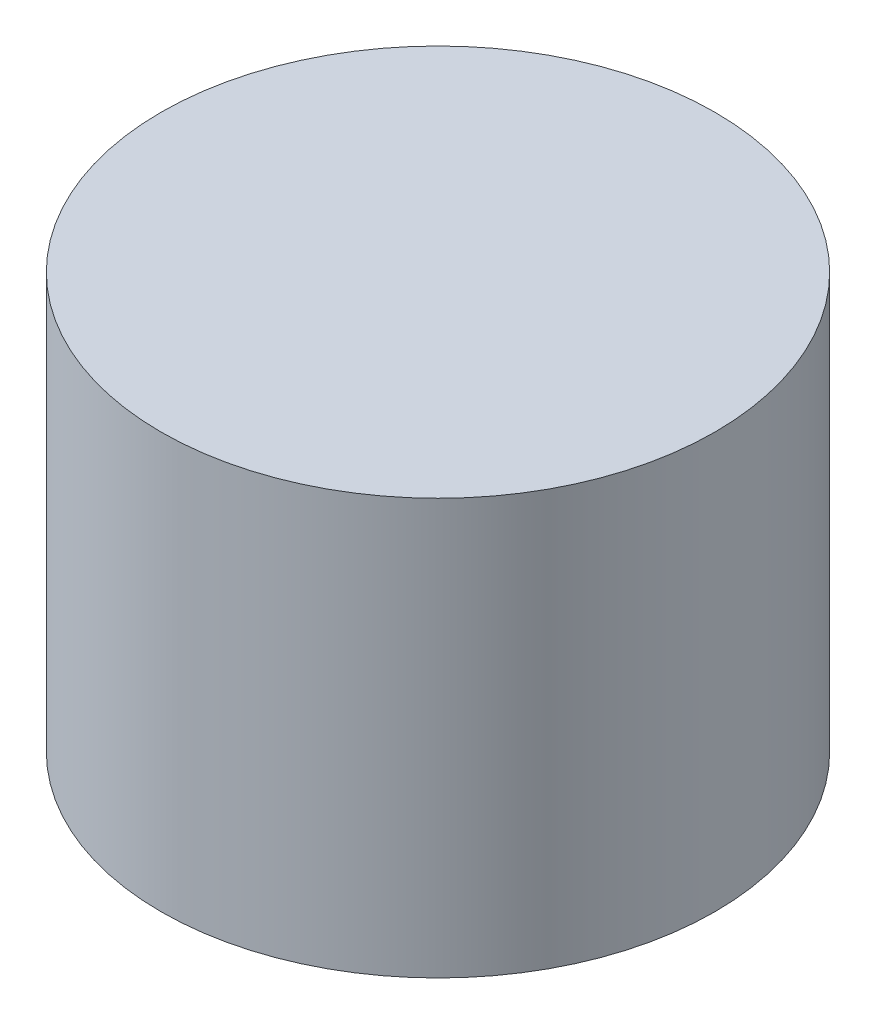
ISO-10303-21;
HEADER;
FILE_DESCRIPTION(('STEP AP214'),'2;1');
FILE_NAME('part.step','',(''),(''),'','','');
FILE_SCHEMA(('AUTOMOTIVE_DESIGN { 1 0 10303 214 1 1 1 1 }'));
ENDSEC;
DATA;
#1=APPLICATION_CONTEXT('core data for automotive mechanical design processes');
#2=APPLICATION_PROTOCOL_DEFINITION('international standard','automotive_design',2000,#1);
#3=PRODUCT_CONTEXT('',#1,'mechanical');
#4=PRODUCT('Part','Part','',(#3));
#5=PRODUCT_RELATED_PRODUCT_CATEGORY('part','',(#4));
#6=PRODUCT_DEFINITION_FORMATION('','',#4);
#7=PRODUCT_DEFINITION_CONTEXT('part definition',#1,'design');
#8=PRODUCT_DEFINITION('design','',#6,#7);
#9=PRODUCT_DEFINITION_SHAPE('','',#8);
#10=(LENGTH_UNIT() NAMED_UNIT(*) SI_UNIT(.MILLI.,.METRE.));
#11=(NAMED_UNIT(*) PLANE_ANGLE_UNIT() SI_UNIT($,.RADIAN.));
#12=(NAMED_UNIT(*) SI_UNIT($,.STERADIAN.) SOLID_ANGLE_UNIT());
#13=UNCERTAINTY_MEASURE_WITH_UNIT(LENGTH_MEASURE(1.E-05),#10,'distance_accuracy_value','');
#14=(GEOMETRIC_REPRESENTATION_CONTEXT(3) GLOBAL_UNCERTAINTY_ASSIGNED_CONTEXT((#13)) GLOBAL_UNIT_ASSIGNED_CONTEXT((#10,
#11,#12)) REPRESENTATION_CONTEXT('',''));
#15=CARTESIAN_POINT('',(0.,0.,0.));
#16=DIRECTION('',(0.,0.,1.));
#17=DIRECTION('',(1.,0.,0.));
#18=AXIS2_PLACEMENT_3D('',#15,#16,#17);
#19=CARTESIAN_POINT('',(0.,45.,0.));
#20=DIRECTION('',(0.,-1.,0.));
#21=DIRECTION('',(0.,0.,-1.));
#22=AXIS2_PLACEMENT_3D('',#19,#20,#21);
#23=CYLINDRICAL_SURFACE('',#22,30.);
#24=CARTESIAN_POINT('',(0.,45.,0.));
#25=DIRECTION('',(0.,1.,0.));
#26=DIRECTION('',(0.,0.,1.));
#27=AXIS2_PLACEMENT_3D('',#24,#25,#26);
#28=CIRCLE('',#27,30.);
#29=CARTESIAN_POINT('',(0.,45.,-30.));
#30=VERTEX_POINT('',#29);
#31=EDGE_CURVE('E10',#30,#30,#28,.T.);
#32=CARTESIAN_POINT('',(0.,0.,0.));
#33=DIRECTION('',(0.,1.,0.));
#34=DIRECTION('',(0.,0.,1.));
#35=AXIS2_PLACEMENT_3D('',#32,#33,#34);
#36=CIRCLE('',#35,30.);
#37=CARTESIAN_POINT('',(0.,0.,-30.));
#38=VERTEX_POINT('',#37);
#39=EDGE_CURVE('E36',#38,#38,#36,.T.);
#40=CARTESIAN_POINT('',(0.,45.,-30.));
#41=CARTESIAN_POINT('',(0.,44.53125,-30.));
#42=CARTESIAN_POINT('',(0.,44.0625,-30.));
#43=CARTESIAN_POINT('',(0.,43.125,-30.));
#44=CARTESIAN_POINT('',(0.,42.65625,-30.));
#45=CARTESIAN_POINT('',(0.,41.71875,-30.));
#46=CARTESIAN_POINT('',(0.,41.25,-30.));
#47=CARTESIAN_POINT('',(0.,40.3125,-30.));
#48=CARTESIAN_POINT('',(0.,39.84375,-30.));
#49=CARTESIAN_POINT('',(0.,38.90625,-30.));
#50=CARTESIAN_POINT('',(0.,38.4375,-30.));
#51=CARTESIAN_POINT('',(0.,37.5,-30.));
#52=CARTESIAN_POINT('',(0.,37.03125,-30.));
#53=CARTESIAN_POINT('',(0.,36.09375,-30.));
#54=CARTESIAN_POINT('',(0.,35.625,-30.));
#55=CARTESIAN_POINT('',(0.,34.6875,-30.));
#56=CARTESIAN_POINT('',(0.,34.21875,-30.));
#57=CARTESIAN_POINT('',(0.,33.28125,-30.));
#58=CARTESIAN_POINT('',(0.,32.8125,-30.));
#59=CARTESIAN_POINT('',(0.,31.875,-30.));
#60=CARTESIAN_POINT('',(0.,31.40625,-30.));
#61=CARTESIAN_POINT('',(0.,30.46875,-30.));
#62=CARTESIAN_POINT('',(0.,30.,-30.));
#63=CARTESIAN_POINT('',(0.,29.0625,-30.));
#64=CARTESIAN_POINT('',(0.,28.59375,-30.));
#65=CARTESIAN_POINT('',(0.,27.65625,-30.));
#66=CARTESIAN_POINT('',(0.,27.1875,-30.));
#67=CARTESIAN_POINT('',(0.,26.25,-30.));
#68=CARTESIAN_POINT('',(0.,25.78125,-30.));
#69=CARTESIAN_POINT('',(0.,24.84375,-30.));
#70=CARTESIAN_POINT('',(0.,24.375,-30.));
#71=CARTESIAN_POINT('',(0.,23.4375,-30.));
#72=CARTESIAN_POINT('',(0.,22.96875,-30.));
#73=CARTESIAN_POINT('',(0.,22.03125,-30.));
#74=CARTESIAN_POINT('',(0.,21.5625,-30.));
#75=CARTESIAN_POINT('',(0.,20.625,-30.));
#76=CARTESIAN_POINT('',(0.,20.15625,-30.));
#77=CARTESIAN_POINT('',(0.,19.21875,-30.));
#78=CARTESIAN_POINT('',(0.,18.75,-30.));
#79=CARTESIAN_POINT('',(0.,17.8125,-30.));
#80=CARTESIAN_POINT('',(0.,17.34375,-30.));
#81=CARTESIAN_POINT('',(0.,16.40625,-30.));
#82=CARTESIAN_POINT('',(0.,15.9375,-30.));
#83=CARTESIAN_POINT('',(0.,15.,-30.));
#84=CARTESIAN_POINT('',(0.,14.53125,-30.));
#85=CARTESIAN_POINT('',(0.,13.59375,-30.));
#86=CARTESIAN_POINT('',(0.,13.125,-30.));
#87=CARTESIAN_POINT('',(0.,12.1875,-30.));
#88=CARTESIAN_POINT('',(0.,11.71875,-30.));
#89=CARTESIAN_POINT('',(0.,10.78125,-30.));
#90=CARTESIAN_POINT('',(0.,10.3125,-30.));
#91=CARTESIAN_POINT('',(0.,9.375,-30.));
#92=CARTESIAN_POINT('',(0.,8.90625,-30.));
#93=CARTESIAN_POINT('',(0.,7.96874999999999,-30.));
#94=CARTESIAN_POINT('',(0.,7.5,-30.));
#95=CARTESIAN_POINT('',(0.,6.5625,-30.));
#96=CARTESIAN_POINT('',(0.,6.09375,-30.));
#97=CARTESIAN_POINT('',(0.,5.15625,-30.));
#98=CARTESIAN_POINT('',(0.,4.68749999999999,-30.));
#99=CARTESIAN_POINT('',(0.,3.74999999999999,-30.));
#100=CARTESIAN_POINT('',(0.,3.28124999999999,-30.));
#101=CARTESIAN_POINT('',(0.,2.34374999999999,-30.));
#102=CARTESIAN_POINT('',(0.,1.87499999999999,-30.));
#103=CARTESIAN_POINT('',(0.,0.937499999999992,-30.));
#104=CARTESIAN_POINT('',(0.,0.468749999999993,-30.));
#105=CARTESIAN_POINT('',(0.,0.,-30.));
#106=B_SPLINE_CURVE_WITH_KNOTS('',3,(#40,#41,#42,#43,#44,#45,#46,#47,#48,#49,#50,#51,#52,#53,
#54,#55,#56,#57,#58,#59,#60,#61,#62,#63,#64,#65,#66,#67,#68,#69,#70,#71,#72,#73,#74,#75,#76,#77,
#78,#79,#80,#81,#82,#83,#84,#85,#86,#87,#88,#89,#90,#91,#92,#93,#94,#95,#96,#97,#98,#99,#100,
#101,#102,#103,#104,#105),.UNSPECIFIED.,.F.,.F.,(4,2,2,2,2,2,2,2,2,2,2,2,2,2,2,2,2,2,2,2,2,2,2,
2,2,2,2,2,2,2,2,2,4),(0.,1.40625,2.8125,4.21875000000001,5.62500000000001,7.03125,8.4375,
9.84375000000001,11.25,12.65625,14.0625,15.46875,16.875,18.28125,19.6875,21.09375,22.5,23.90625,
25.3125,26.71875,28.125,29.53125,30.9375,32.34375,33.75,35.15625,36.5625,37.96875,39.375,
40.78125,42.1875,43.59375,45.),.UNSPECIFIED.);
#107=EDGE_CURVE('BSEAM33',#30,#38,#106,.T.);
#108=ORIENTED_EDGE('',*,*,#31,.F.);
#109=ORIENTED_EDGE('',*,*,#39,.T.);
#110=ORIENTED_EDGE('',*,*,#107,.T.);
#111=ORIENTED_EDGE('',*,*,#107,.F.);
#112=EDGE_LOOP('',(#108,#110,#109,#111));
#113=FACE_BOUND('',#112,.T.);
#114=ADVANCED_FACE('F33',(#113),#23,.T.);
#115=CARTESIAN_POINT('',(0.,45.,0.));
#116=DIRECTION('',(0.,1.,0.));
#117=DIRECTION('',(0.,0.,1.));
#118=AXIS2_PLACEMENT_3D('',#115,#116,#117);
#119=PLANE('',#118);
#120=ORIENTED_EDGE('',*,*,#31,.T.);
#121=EDGE_LOOP('',(#120));
#122=FACE_BOUND('',#121,.T.);
#123=ADVANCED_FACE('F48',(#122),#119,.T.);
#124=CARTESIAN_POINT('',(0.,0.,0.));
#125=DIRECTION('',(0.,1.,0.));
#126=DIRECTION('',(0.,0.,1.));
#127=AXIS2_PLACEMENT_3D('',#124,#125,#126);
#128=PLANE('',#127);
#129=ORIENTED_EDGE('',*,*,#39,.F.);
#130=EDGE_LOOP('',(#129));
#131=FACE_BOUND('',#130,.T.);
#132=ADVANCED_FACE('F46',(#131),#128,.F.);
#133=CLOSED_SHELL('',(#114,#123,#132));
#134=MANIFOLD_SOLID_BREP('B2',#133);
#135=ADVANCED_BREP_SHAPE_REPRESENTATION('',(#18,#134),#14);
#136=SHAPE_DEFINITION_REPRESENTATION(#9,#135);
ENDSEC;
END-ISO-10303-21;
